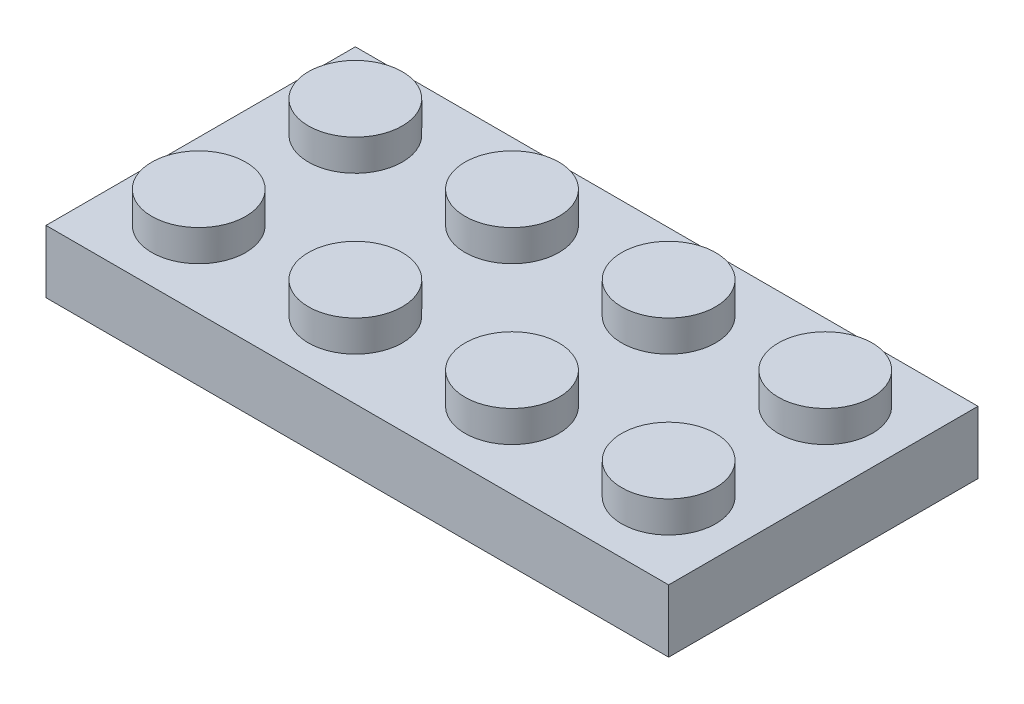
ISO-10303-21;
HEADER;
FILE_DESCRIPTION(('STEP AP214'),'2;1');
FILE_NAME('part.step','',(''),(''),'','','');
FILE_SCHEMA(('AUTOMOTIVE_DESIGN { 1 0 10303 214 1 1 1 1 }'));
ENDSEC;
DATA;
#1=APPLICATION_CONTEXT('core data for automotive mechanical design processes');
#2=APPLICATION_PROTOCOL_DEFINITION('international standard','automotive_design',2000,#1);
#3=PRODUCT_CONTEXT('',#1,'mechanical');
#4=PRODUCT('Part','Part','',(#3));
#5=PRODUCT_RELATED_PRODUCT_CATEGORY('part','',(#4));
#6=PRODUCT_DEFINITION_FORMATION('','',#4);
#7=PRODUCT_DEFINITION_CONTEXT('part definition',#1,'design');
#8=PRODUCT_DEFINITION('design','',#6,#7);
#9=PRODUCT_DEFINITION_SHAPE('','',#8);
#10=(LENGTH_UNIT() NAMED_UNIT(*) SI_UNIT(.MILLI.,.METRE.));
#11=(NAMED_UNIT(*) PLANE_ANGLE_UNIT() SI_UNIT($,.RADIAN.));
#12=(NAMED_UNIT(*) SI_UNIT($,.STERADIAN.) SOLID_ANGLE_UNIT());
#13=UNCERTAINTY_MEASURE_WITH_UNIT(LENGTH_MEASURE(1.E-05),#10,'distance_accuracy_value','');
#14=(GEOMETRIC_REPRESENTATION_CONTEXT(3) GLOBAL_UNCERTAINTY_ASSIGNED_CONTEXT((#13)) GLOBAL_UNIT_ASSIGNED_CONTEXT((#10,
#11,#12)) REPRESENTATION_CONTEXT('',''));
#15=CARTESIAN_POINT('',(0.,0.,0.));
#16=DIRECTION('',(0.,0.,1.));
#17=DIRECTION('',(1.,0.,0.));
#18=AXIS2_PLACEMENT_3D('',#15,#16,#17);
#19=CARTESIAN_POINT('',(0.681967213114738,0.,7.9));
#20=DIRECTION('',(0.,1.,0.));
#21=DIRECTION('',(0.,0.,1.));
#22=AXIS2_PLACEMENT_3D('',#19,#20,#21);
#23=PLANE('',#22);
#24=DIRECTION('',(1.,0.,0.));
#25=VECTOR('',#24,1.);
#26=CARTESIAN_POINT('',(0.681967213114738,0.,-7.9));
#27=LINE('',#26,#25);
#28=CARTESIAN_POINT('',(0.681967213114738,0.,-7.9));
#29=VERTEX_POINT('',#28);
#30=CARTESIAN_POINT('',(32.4819672131147,0.,-7.9));
#31=VERTEX_POINT('',#30);
#32=EDGE_CURVE('E185',#29,#31,#27,.T.);
#33=ORIENTED_EDGE('',*,*,#32,.T.);
#34=DIRECTION('',(0.,0.,-1.));
#35=VECTOR('',#34,1.);
#36=CARTESIAN_POINT('',(32.4819672131147,0.,7.9));
#37=LINE('',#36,#35);
#38=CARTESIAN_POINT('',(32.4819672131147,0.,7.9));
#39=VERTEX_POINT('',#38);
#40=EDGE_CURVE('E193',#39,#31,#37,.T.);
#41=ORIENTED_EDGE('',*,*,#40,.F.);
#42=DIRECTION('',(1.,0.,0.));
#43=VECTOR('',#42,1.);
#44=CARTESIAN_POINT('',(0.681967213114738,0.,7.9));
#45=LINE('',#44,#43);
#46=CARTESIAN_POINT('',(0.681967213114738,0.,7.9));
#47=VERTEX_POINT('',#46);
#48=EDGE_CURVE('E97',#47,#39,#45,.T.);
#49=ORIENTED_EDGE('',*,*,#48,.F.);
#50=DIRECTION('',(0.,0.,-1.));
#51=VECTOR('',#50,1.);
#52=CARTESIAN_POINT('',(0.681967213114738,0.,7.9));
#53=LINE('',#52,#51);
#54=EDGE_CURVE('E196',#47,#29,#53,.T.);
#55=ORIENTED_EDGE('',*,*,#54,.T.);
#56=EDGE_LOOP('',(#33,#41,#49,#55));
#57=FACE_BOUND('',#56,.T.);
#58=DIRECTION('',(1.,0.,0.));
#59=VECTOR('',#58,1.);
#60=CARTESIAN_POINT('',(0.,0.,-6.7));
#61=LINE('',#60,#59);
#62=CARTESIAN_POINT('',(1.88196721311474,0.,-6.7));
#63=VERTEX_POINT('',#62);
#64=CARTESIAN_POINT('',(31.2819672131147,0.,-6.7));
#65=VERTEX_POINT('',#64);
#66=EDGE_CURVE('E142',#63,#65,#61,.T.);
#67=ORIENTED_EDGE('',*,*,#66,.F.);
#68=DIRECTION('',(0.,0.,-1.));
#69=VECTOR('',#68,1.);
#70=CARTESIAN_POINT('',(1.88196721311474,0.,7.9));
#71=LINE('',#70,#69);
#72=CARTESIAN_POINT('',(1.88196721311474,0.,6.7));
#73=VERTEX_POINT('',#72);
#74=EDGE_CURVE('E141',#73,#63,#71,.T.);
#75=ORIENTED_EDGE('',*,*,#74,.F.);
#76=DIRECTION('',(1.,0.,0.));
#77=VECTOR('',#76,1.);
#78=CARTESIAN_POINT('',(0.,0.,6.7));
#79=LINE('',#78,#77);
#80=CARTESIAN_POINT('',(31.2819672131147,0.,6.7));
#81=VERTEX_POINT('',#80);
#82=EDGE_CURVE('E154',#73,#81,#79,.T.);
#83=ORIENTED_EDGE('',*,*,#82,.T.);
#84=DIRECTION('',(0.,0.,-1.));
#85=VECTOR('',#84,1.);
#86=CARTESIAN_POINT('',(31.2819672131147,0.,7.9));
#87=LINE('',#86,#85);
#88=EDGE_CURVE('E162',#81,#65,#87,.T.);
#89=ORIENTED_EDGE('',*,*,#88,.T.);
#90=EDGE_LOOP('',(#67,#75,#83,#89));
#91=FACE_BOUND('',#90,.T.);
#92=ADVANCED_FACE('F43',(#57,#91),#23,.F.);
#93=CARTESIAN_POINT('',(28.5819672131147,4.8,4.));
#94=DIRECTION('',(0.,1.,0.));
#95=DIRECTION('',(0.,0.,1.));
#96=AXIS2_PLACEMENT_3D('',#93,#94,#95);
#97=PLANE('',#96);
#98=CARTESIAN_POINT('',(28.5819672131147,4.8,4.));
#99=DIRECTION('',(0.,1.,0.));
#100=DIRECTION('',(0.,0.,1.));
#101=AXIS2_PLACEMENT_3D('',#98,#99,#100);
#102=CIRCLE('',#101,2.4);
#103=CARTESIAN_POINT('',(28.5819672131147,4.8,6.4));
#104=VERTEX_POINT('',#103);
#105=EDGE_CURVE('E237',#104,#104,#102,.T.);
#106=ORIENTED_EDGE('',*,*,#105,.T.);
#107=EDGE_LOOP('',(#106));
#108=FACE_BOUND('',#107,.T.);
#109=ADVANCED_FACE('F45',(#108),#97,.T.);
#110=CARTESIAN_POINT('',(28.5819672131147,4.8,4.));
#111=DIRECTION('',(0.,-1.,0.));
#112=DIRECTION('',(0.,0.,-1.));
#113=AXIS2_PLACEMENT_3D('',#110,#111,#112);
#114=CYLINDRICAL_SURFACE('',#113,2.4);
#115=ORIENTED_EDGE('',*,*,#105,.F.);
#116=EDGE_LOOP('',(#115));
#117=FACE_BOUND('',#116,.T.);
#118=CARTESIAN_POINT('',(28.5819672131147,3.2,4.));
#119=DIRECTION('',(0.,-1.,0.));
#120=DIRECTION('',(1.,0.,0.));
#121=AXIS2_PLACEMENT_3D('',#118,#119,#120);
#122=CIRCLE('',#121,2.4);
#123=CARTESIAN_POINT('',(30.9819672131147,3.2,4.));
#124=VERTEX_POINT('',#123);
#125=EDGE_CURVE('E234',#124,#124,#122,.F.);
#126=ORIENTED_EDGE('',*,*,#125,.T.);
#127=EDGE_LOOP('',(#126));
#128=FACE_BOUND('',#127,.T.);
#129=ADVANCED_FACE('F335',(#117,#128),#114,.T.);
#130=CARTESIAN_POINT('',(28.5819672131147,4.8,-4.));
#131=DIRECTION('',(0.,1.,0.));
#132=DIRECTION('',(0.,0.,1.));
#133=AXIS2_PLACEMENT_3D('',#130,#131,#132);
#134=PLANE('',#133);
#135=CARTESIAN_POINT('',(28.5819672131147,4.8,-4.));
#136=DIRECTION('',(0.,1.,0.));
#137=DIRECTION('',(0.,0.,1.));
#138=AXIS2_PLACEMENT_3D('',#135,#136,#137);
#139=CIRCLE('',#138,2.4);
#140=CARTESIAN_POINT('',(28.5819672131147,4.8,-1.6));
#141=VERTEX_POINT('',#140);
#142=EDGE_CURVE('E231',#141,#141,#139,.T.);
#143=ORIENTED_EDGE('',*,*,#142,.T.);
#144=EDGE_LOOP('',(#143));
#145=FACE_BOUND('',#144,.T.);
#146=ADVANCED_FACE('F381',(#145),#134,.T.);
#147=CARTESIAN_POINT('',(28.5819672131147,4.8,-4.));
#148=DIRECTION('',(0.,-1.,0.));
#149=DIRECTION('',(0.,0.,-1.));
#150=AXIS2_PLACEMENT_3D('',#147,#148,#149);
#151=CYLINDRICAL_SURFACE('',#150,2.4);
#152=ORIENTED_EDGE('',*,*,#142,.F.);
#153=EDGE_LOOP('',(#152));
#154=FACE_BOUND('',#153,.T.);
#155=CARTESIAN_POINT('',(28.5819672131147,3.2,-4.));
#156=DIRECTION('',(0.,-1.,0.));
#157=DIRECTION('',(1.,0.,0.));
#158=AXIS2_PLACEMENT_3D('',#155,#156,#157);
#159=CIRCLE('',#158,2.4);
#160=CARTESIAN_POINT('',(30.9819672131147,3.2,-4.));
#161=VERTEX_POINT('',#160);
#162=EDGE_CURVE('E228',#161,#161,#159,.F.);
#163=ORIENTED_EDGE('',*,*,#162,.T.);
#164=EDGE_LOOP('',(#163));
#165=FACE_BOUND('',#164,.T.);
#166=ADVANCED_FACE('F377',(#154,#165),#151,.T.);
#167=CARTESIAN_POINT('',(20.5819672131147,4.8,4.));
#168=DIRECTION('',(0.,1.,0.));
#169=DIRECTION('',(0.,0.,1.));
#170=AXIS2_PLACEMENT_3D('',#167,#168,#169);
#171=PLANE('',#170);
#172=CARTESIAN_POINT('',(20.5819672131147,4.8,4.));
#173=DIRECTION('',(0.,1.,0.));
#174=DIRECTION('',(0.,0.,1.));
#175=AXIS2_PLACEMENT_3D('',#172,#173,#174);
#176=CIRCLE('',#175,2.4);
#177=CARTESIAN_POINT('',(20.5819672131147,4.8,6.4));
#178=VERTEX_POINT('',#177);
#179=EDGE_CURVE('E225',#178,#178,#176,.T.);
#180=ORIENTED_EDGE('',*,*,#179,.T.);
#181=EDGE_LOOP('',(#180));
#182=FACE_BOUND('',#181,.T.);
#183=ADVANCED_FACE('F373',(#182),#171,.T.);
#184=CARTESIAN_POINT('',(20.5819672131147,4.8,4.));
#185=DIRECTION('',(0.,-1.,0.));
#186=DIRECTION('',(0.,0.,-1.));
#187=AXIS2_PLACEMENT_3D('',#184,#185,#186);
#188=CYLINDRICAL_SURFACE('',#187,2.4);
#189=ORIENTED_EDGE('',*,*,#179,.F.);
#190=EDGE_LOOP('',(#189));
#191=FACE_BOUND('',#190,.T.);
#192=CARTESIAN_POINT('',(20.5819672131147,3.2,4.));
#193=DIRECTION('',(0.,-1.,0.));
#194=DIRECTION('',(1.,0.,0.));
#195=AXIS2_PLACEMENT_3D('',#192,#193,#194);
#196=CIRCLE('',#195,2.4);
#197=CARTESIAN_POINT('',(22.9819672131147,3.2,4.));
#198=VERTEX_POINT('',#197);
#199=EDGE_CURVE('E222',#198,#198,#196,.F.);
#200=ORIENTED_EDGE('',*,*,#199,.T.);
#201=EDGE_LOOP('',(#200));
#202=FACE_BOUND('',#201,.T.);
#203=ADVANCED_FACE('F369',(#191,#202),#188,.T.);
#204=CARTESIAN_POINT('',(20.5819672131147,4.8,-4.));
#205=DIRECTION('',(0.,1.,0.));
#206=DIRECTION('',(0.,0.,1.));
#207=AXIS2_PLACEMENT_3D('',#204,#205,#206);
#208=PLANE('',#207);
#209=CARTESIAN_POINT('',(20.5819672131147,4.8,-4.));
#210=DIRECTION('',(0.,1.,0.));
#211=DIRECTION('',(0.,0.,1.));
#212=AXIS2_PLACEMENT_3D('',#209,#210,#211);
#213=CIRCLE('',#212,2.4);
#214=CARTESIAN_POINT('',(20.5819672131147,4.8,-1.6));
#215=VERTEX_POINT('',#214);
#216=EDGE_CURVE('E219',#215,#215,#213,.T.);
#217=ORIENTED_EDGE('',*,*,#216,.T.);
#218=EDGE_LOOP('',(#217));
#219=FACE_BOUND('',#218,.T.);
#220=ADVANCED_FACE('F365',(#219),#208,.T.);
#221=CARTESIAN_POINT('',(20.5819672131147,4.8,-4.));
#222=DIRECTION('',(0.,-1.,0.));
#223=DIRECTION('',(0.,0.,-1.));
#224=AXIS2_PLACEMENT_3D('',#221,#222,#223);
#225=CYLINDRICAL_SURFACE('',#224,2.4);
#226=ORIENTED_EDGE('',*,*,#216,.F.);
#227=EDGE_LOOP('',(#226));
#228=FACE_BOUND('',#227,.T.);
#229=CARTESIAN_POINT('',(20.5819672131147,3.2,-4.));
#230=DIRECTION('',(0.,-1.,0.));
#231=DIRECTION('',(1.,0.,0.));
#232=AXIS2_PLACEMENT_3D('',#229,#230,#231);
#233=CIRCLE('',#232,2.4);
#234=CARTESIAN_POINT('',(22.9819672131147,3.2,-4.));
#235=VERTEX_POINT('',#234);
#236=EDGE_CURVE('E216',#235,#235,#233,.F.);
#237=ORIENTED_EDGE('',*,*,#236,.T.);
#238=EDGE_LOOP('',(#237));
#239=FACE_BOUND('',#238,.T.);
#240=ADVANCED_FACE('F361',(#228,#239),#225,.T.);
#241=CARTESIAN_POINT('',(12.5819672131147,4.8,4.));
#242=DIRECTION('',(0.,1.,0.));
#243=DIRECTION('',(0.,0.,1.));
#244=AXIS2_PLACEMENT_3D('',#241,#242,#243);
#245=PLANE('',#244);
#246=CARTESIAN_POINT('',(12.5819672131147,4.8,4.));
#247=DIRECTION('',(0.,1.,0.));
#248=DIRECTION('',(0.,0.,1.));
#249=AXIS2_PLACEMENT_3D('',#246,#247,#248);
#250=CIRCLE('',#249,2.4);
#251=CARTESIAN_POINT('',(12.5819672131147,4.8,6.4));
#252=VERTEX_POINT('',#251);
#253=EDGE_CURVE('E213',#252,#252,#250,.T.);
#254=ORIENTED_EDGE('',*,*,#253,.T.);
#255=EDGE_LOOP('',(#254));
#256=FACE_BOUND('',#255,.T.);
#257=ADVANCED_FACE('F357',(#256),#245,.T.);
#258=CARTESIAN_POINT('',(12.5819672131147,4.8,4.));
#259=DIRECTION('',(0.,-1.,0.));
#260=DIRECTION('',(0.,0.,-1.));
#261=AXIS2_PLACEMENT_3D('',#258,#259,#260);
#262=CYLINDRICAL_SURFACE('',#261,2.4);
#263=ORIENTED_EDGE('',*,*,#253,.F.);
#264=EDGE_LOOP('',(#263));
#265=FACE_BOUND('',#264,.T.);
#266=CARTESIAN_POINT('',(12.5819672131147,3.2,4.));
#267=DIRECTION('',(0.,-1.,0.));
#268=DIRECTION('',(1.,0.,0.));
#269=AXIS2_PLACEMENT_3D('',#266,#267,#268);
#270=CIRCLE('',#269,2.4);
#271=CARTESIAN_POINT('',(14.9819672131147,3.2,4.));
#272=VERTEX_POINT('',#271);
#273=EDGE_CURVE('E210',#272,#272,#270,.F.);
#274=ORIENTED_EDGE('',*,*,#273,.T.);
#275=EDGE_LOOP('',(#274));
#276=FACE_BOUND('',#275,.T.);
#277=ADVANCED_FACE('F353',(#265,#276),#262,.T.);
#278=CARTESIAN_POINT('',(12.5819672131147,4.8,-4.));
#279=DIRECTION('',(0.,1.,0.));
#280=DIRECTION('',(0.,0.,1.));
#281=AXIS2_PLACEMENT_3D('',#278,#279,#280);
#282=PLANE('',#281);
#283=CARTESIAN_POINT('',(12.5819672131147,4.8,-4.));
#284=DIRECTION('',(0.,1.,0.));
#285=DIRECTION('',(0.,0.,1.));
#286=AXIS2_PLACEMENT_3D('',#283,#284,#285);
#287=CIRCLE('',#286,2.4);
#288=CARTESIAN_POINT('',(12.5819672131147,4.8,-1.6));
#289=VERTEX_POINT('',#288);
#290=EDGE_CURVE('E207',#289,#289,#287,.T.);
#291=ORIENTED_EDGE('',*,*,#290,.T.);
#292=EDGE_LOOP('',(#291));
#293=FACE_BOUND('',#292,.T.);
#294=ADVANCED_FACE('F349',(#293),#282,.T.);
#295=CARTESIAN_POINT('',(12.5819672131147,4.8,-4.));
#296=DIRECTION('',(0.,-1.,0.));
#297=DIRECTION('',(0.,0.,-1.));
#298=AXIS2_PLACEMENT_3D('',#295,#296,#297);
#299=CYLINDRICAL_SURFACE('',#298,2.4);
#300=ORIENTED_EDGE('',*,*,#290,.F.);
#301=EDGE_LOOP('',(#300));
#302=FACE_BOUND('',#301,.T.);
#303=CARTESIAN_POINT('',(12.5819672131147,3.2,-4.));
#304=DIRECTION('',(0.,-1.,0.));
#305=DIRECTION('',(1.,0.,0.));
#306=AXIS2_PLACEMENT_3D('',#303,#304,#305);
#307=CIRCLE('',#306,2.4);
#308=CARTESIAN_POINT('',(14.9819672131147,3.2,-4.));
#309=VERTEX_POINT('',#308);
#310=EDGE_CURVE('E204',#309,#309,#307,.F.);
#311=ORIENTED_EDGE('',*,*,#310,.T.);
#312=EDGE_LOOP('',(#311));
#313=FACE_BOUND('',#312,.T.);
#314=ADVANCED_FACE('F345',(#302,#313),#299,.T.);
#315=CARTESIAN_POINT('',(0.681967213114738,0.,7.9));
#316=DIRECTION('',(1.,0.,0.));
#317=DIRECTION('',(0.,0.,-1.));
#318=AXIS2_PLACEMENT_3D('',#315,#316,#317);
#319=PLANE('',#318);
#320=DIRECTION('',(0.,-1.,0.));
#321=VECTOR('',#320,1.);
#322=CARTESIAN_POINT('',(0.681967213114738,0.,-7.9));
#323=LINE('',#322,#321);
#324=CARTESIAN_POINT('',(0.681967213114738,3.2,-7.9));
#325=VERTEX_POINT('',#324);
#326=EDGE_CURVE('E175',#325,#29,#323,.T.);
#327=ORIENTED_EDGE('',*,*,#326,.T.);
#328=ORIENTED_EDGE('',*,*,#54,.F.);
#329=DIRECTION('',(0.,-1.,0.));
#330=VECTOR('',#329,1.);
#331=CARTESIAN_POINT('',(0.681967213114738,0.,7.9));
#332=LINE('',#331,#330);
#333=CARTESIAN_POINT('',(0.681967213114738,3.2,7.9));
#334=VERTEX_POINT('',#333);
#335=EDGE_CURVE('E176',#334,#47,#332,.T.);
#336=ORIENTED_EDGE('',*,*,#335,.F.);
#337=DIRECTION('',(0.,0.,-1.));
#338=VECTOR('',#337,1.);
#339=CARTESIAN_POINT('',(0.681967213114738,3.2,7.9));
#340=LINE('',#339,#338);
#341=EDGE_CURVE('E182',#334,#325,#340,.T.);
#342=ORIENTED_EDGE('',*,*,#341,.T.);
#343=EDGE_LOOP('',(#327,#328,#336,#342));
#344=FACE_BOUND('',#343,.T.);
#345=ADVANCED_FACE('F342',(#344),#319,.F.);
#346=CARTESIAN_POINT('',(32.4819672131147,0.,7.9));
#347=DIRECTION('',(-1.,0.,0.));
#348=DIRECTION('',(0.,0.,1.));
#349=AXIS2_PLACEMENT_3D('',#346,#347,#348);
#350=PLANE('',#349);
#351=DIRECTION('',(0.,1.,0.));
#352=VECTOR('',#351,1.);
#353=CARTESIAN_POINT('',(32.4819672131147,0.,-7.9));
#354=LINE('',#353,#352);
#355=CARTESIAN_POINT('',(32.4819672131147,3.2,-7.9));
#356=VERTEX_POINT('',#355);
#357=EDGE_CURVE('E187',#31,#356,#354,.T.);
#358=ORIENTED_EDGE('',*,*,#357,.T.);
#359=DIRECTION('',(0.,0.,-1.));
#360=VECTOR('',#359,1.);
#361=CARTESIAN_POINT('',(32.4819672131147,3.2,7.9));
#362=LINE('',#361,#360);
#363=CARTESIAN_POINT('',(32.4819672131147,3.2,7.9));
#364=VERTEX_POINT('',#363);
#365=EDGE_CURVE('E191',#364,#356,#362,.T.);
#366=ORIENTED_EDGE('',*,*,#365,.F.);
#367=DIRECTION('',(0.,1.,0.));
#368=VECTOR('',#367,1.);
#369=CARTESIAN_POINT('',(32.4819672131147,0.,7.9));
#370=LINE('',#369,#368);
#371=EDGE_CURVE('E179',#39,#364,#370,.T.);
#372=ORIENTED_EDGE('',*,*,#371,.F.);
#373=ORIENTED_EDGE('',*,*,#40,.T.);
#374=EDGE_LOOP('',(#358,#366,#372,#373));
#375=FACE_BOUND('',#374,.T.);
#376=ADVANCED_FACE('F340',(#375),#350,.F.);
#377=CARTESIAN_POINT('',(0.681967213114738,3.2,7.9));
#378=DIRECTION('',(0.,-1.,0.));
#379=DIRECTION('',(1.,0.,0.));
#380=AXIS2_PLACEMENT_3D('',#377,#378,#379);
#381=PLANE('',#380);
#382=CARTESIAN_POINT('',(4.58196721311474,3.2,4.));
#383=DIRECTION('',(0.,-1.,0.));
#384=DIRECTION('',(1.,0.,0.));
#385=AXIS2_PLACEMENT_3D('',#382,#383,#384);
#386=CIRCLE('',#385,2.4);
#387=CARTESIAN_POINT('',(6.98196721311474,3.2,4.));
#388=VERTEX_POINT('',#387);
#389=EDGE_CURVE('E201',#388,#388,#386,.F.);
#390=ORIENTED_EDGE('',*,*,#389,.F.);
#391=EDGE_LOOP('',(#390));
#392=FACE_BOUND('',#391,.T.);
#393=CARTESIAN_POINT('',(4.58196721311474,3.2,-4.));
#394=DIRECTION('',(0.,-1.,0.));
#395=DIRECTION('',(1.,0.,0.));
#396=AXIS2_PLACEMENT_3D('',#393,#394,#395);
#397=CIRCLE('',#396,2.4);
#398=CARTESIAN_POINT('',(6.98196721311474,3.2,-4.));
#399=VERTEX_POINT('',#398);
#400=EDGE_CURVE('E198',#399,#399,#397,.F.);
#401=ORIENTED_EDGE('',*,*,#400,.F.);
#402=EDGE_LOOP('',(#401));
#403=FACE_BOUND('',#402,.T.);
#404=DIRECTION('',(-1.,0.,0.));
#405=VECTOR('',#404,1.);
#406=CARTESIAN_POINT('',(0.681967213114738,3.2,-7.9));
#407=LINE('',#406,#405);
#408=EDGE_CURVE('E89',#356,#325,#407,.T.);
#409=ORIENTED_EDGE('',*,*,#408,.T.);
#410=ORIENTED_EDGE('',*,*,#341,.F.);
#411=DIRECTION('',(-1.,0.,0.));
#412=VECTOR('',#411,1.);
#413=CARTESIAN_POINT('',(0.681967213114738,3.2,7.9));
#414=LINE('',#413,#412);
#415=EDGE_CURVE('E68',#364,#334,#414,.T.);
#416=ORIENTED_EDGE('',*,*,#415,.F.);
#417=ORIENTED_EDGE('',*,*,#365,.T.);
#418=EDGE_LOOP('',(#409,#410,#416,#417));
#419=FACE_BOUND('',#418,.T.);
#420=ORIENTED_EDGE('',*,*,#310,.F.);
#421=EDGE_LOOP('',(#420));
#422=FACE_BOUND('',#421,.T.);
#423=ORIENTED_EDGE('',*,*,#273,.F.);
#424=EDGE_LOOP('',(#423));
#425=FACE_BOUND('',#424,.T.);
#426=ORIENTED_EDGE('',*,*,#236,.F.);
#427=EDGE_LOOP('',(#426));
#428=FACE_BOUND('',#427,.T.);
#429=ORIENTED_EDGE('',*,*,#199,.F.);
#430=EDGE_LOOP('',(#429));
#431=FACE_BOUND('',#430,.T.);
#432=ORIENTED_EDGE('',*,*,#162,.F.);
#433=EDGE_LOOP('',(#432));
#434=FACE_BOUND('',#433,.T.);
#435=ORIENTED_EDGE('',*,*,#125,.F.);
#436=EDGE_LOOP('',(#435));
#437=FACE_BOUND('',#436,.T.);
#438=ADVANCED_FACE('F393',(#392,#403,#419,#422,#425,#428,#431,#434,#437),#381,.F.);
#439=CARTESIAN_POINT('',(0.,0.,7.9));
#440=DIRECTION('',(0.,0.,-1.));
#441=DIRECTION('',(-1.,0.,0.));
#442=AXIS2_PLACEMENT_3D('',#439,#440,#441);
#443=PLANE('',#442);
#444=ORIENTED_EDGE('',*,*,#335,.T.);
#445=ORIENTED_EDGE('',*,*,#48,.T.);
#446=ORIENTED_EDGE('',*,*,#371,.T.);
#447=ORIENTED_EDGE('',*,*,#415,.T.);
#448=EDGE_LOOP('',(#444,#445,#446,#447));
#449=FACE_BOUND('',#448,.T.);
#450=ADVANCED_FACE('F395',(#449),#443,.F.);
#451=CARTESIAN_POINT('',(0.,0.,-7.9));
#452=DIRECTION('',(0.,0.,-1.));
#453=DIRECTION('',(-1.,0.,0.));
#454=AXIS2_PLACEMENT_3D('',#451,#452,#453);
#455=PLANE('',#454);
#456=ORIENTED_EDGE('',*,*,#326,.F.);
#457=ORIENTED_EDGE('',*,*,#408,.F.);
#458=ORIENTED_EDGE('',*,*,#357,.F.);
#459=ORIENTED_EDGE('',*,*,#32,.F.);
#460=EDGE_LOOP('',(#456,#457,#458,#459));
#461=FACE_BOUND('',#460,.T.);
#462=ADVANCED_FACE('F401',(#461),#455,.T.);
#463=CARTESIAN_POINT('',(4.58196721311474,4.8,-4.));
#464=DIRECTION('',(0.,-1.,0.));
#465=DIRECTION('',(0.,0.,-1.));
#466=AXIS2_PLACEMENT_3D('',#463,#464,#465);
#467=CYLINDRICAL_SURFACE('',#466,2.4);
#468=CARTESIAN_POINT('',(4.58196721311474,4.8,-4.));
#469=DIRECTION('',(0.,1.,0.));
#470=DIRECTION('',(0.,0.,1.));
#471=AXIS2_PLACEMENT_3D('',#468,#469,#470);
#472=CIRCLE('',#471,2.4);
#473=CARTESIAN_POINT('',(4.58196721311474,4.8,-1.6));
#474=VERTEX_POINT('',#473);
#475=EDGE_CURVE('E171',#474,#474,#472,.T.);
#476=ORIENTED_EDGE('',*,*,#475,.F.);
#477=EDGE_LOOP('',(#476));
#478=FACE_BOUND('',#477,.T.);
#479=ORIENTED_EDGE('',*,*,#400,.T.);
#480=EDGE_LOOP('',(#479));
#481=FACE_BOUND('',#480,.T.);
#482=ADVANCED_FACE('F409',(#478,#481),#467,.T.);
#483=CARTESIAN_POINT('',(4.58196721311474,4.8,-4.));
#484=DIRECTION('',(0.,1.,0.));
#485=DIRECTION('',(0.,0.,1.));
#486=AXIS2_PLACEMENT_3D('',#483,#484,#485);
#487=PLANE('',#486);
#488=ORIENTED_EDGE('',*,*,#475,.T.);
#489=EDGE_LOOP('',(#488));
#490=FACE_BOUND('',#489,.T.);
#491=ADVANCED_FACE('F414',(#490),#487,.T.);
#492=CARTESIAN_POINT('',(4.58196721311474,4.8,4.));
#493=DIRECTION('',(0.,-1.,0.));
#494=DIRECTION('',(0.,0.,-1.));
#495=AXIS2_PLACEMENT_3D('',#492,#493,#494);
#496=CYLINDRICAL_SURFACE('',#495,2.4);
#497=CARTESIAN_POINT('',(4.58196721311474,4.8,4.));
#498=DIRECTION('',(0.,1.,0.));
#499=DIRECTION('',(0.,0.,1.));
#500=AXIS2_PLACEMENT_3D('',#497,#498,#499);
#501=CIRCLE('',#500,2.4);
#502=CARTESIAN_POINT('',(4.58196721311474,4.8,6.4));
#503=VERTEX_POINT('',#502);
#504=EDGE_CURVE('E168',#503,#503,#501,.T.);
#505=ORIENTED_EDGE('',*,*,#504,.F.);
#506=EDGE_LOOP('',(#505));
#507=FACE_BOUND('',#506,.T.);
#508=ORIENTED_EDGE('',*,*,#389,.T.);
#509=EDGE_LOOP('',(#508));
#510=FACE_BOUND('',#509,.T.);
#511=ADVANCED_FACE('F418',(#507,#510),#496,.T.);
#512=CARTESIAN_POINT('',(4.58196721311474,4.8,4.));
#513=DIRECTION('',(0.,1.,0.));
#514=DIRECTION('',(0.,0.,1.));
#515=AXIS2_PLACEMENT_3D('',#512,#513,#514);
#516=PLANE('',#515);
#517=ORIENTED_EDGE('',*,*,#504,.T.);
#518=EDGE_LOOP('',(#517));
#519=FACE_BOUND('',#518,.T.);
#520=ADVANCED_FACE('F421',(#519),#516,.T.);
#521=CARTESIAN_POINT('',(28.5819672131147,3.6,4.));
#522=DIRECTION('',(0.,1.,0.));
#523=DIRECTION('',(0.,0.,1.));
#524=AXIS2_PLACEMENT_3D('',#521,#522,#523);
#525=PLANE('',#524);
#526=CARTESIAN_POINT('',(28.5819672131147,3.6,4.));
#527=DIRECTION('',(0.,1.,0.));
#528=DIRECTION('',(0.,0.,1.));
#529=AXIS2_PLACEMENT_3D('',#526,#527,#528);
#530=CIRCLE('',#529,1.2);
#531=CARTESIAN_POINT('',(28.5819672131147,3.6,5.2));
#532=VERTEX_POINT('',#531);
#533=EDGE_CURVE('E172',#532,#532,#530,.T.);
#534=ORIENTED_EDGE('',*,*,#533,.F.);
#535=EDGE_LOOP('',(#534));
#536=FACE_BOUND('',#535,.T.);
#537=ADVANCED_FACE('F425',(#536),#525,.F.);
#538=CARTESIAN_POINT('',(28.5819672131147,4.8,4.));
#539=DIRECTION('',(0.,-1.,0.));
#540=DIRECTION('',(0.,0.,-1.));
#541=AXIS2_PLACEMENT_3D('',#538,#539,#540);
#542=CYLINDRICAL_SURFACE('',#541,1.2);
#543=ORIENTED_EDGE('',*,*,#533,.T.);
#544=EDGE_LOOP('',(#543));
#545=FACE_BOUND('',#544,.T.);
#546=CARTESIAN_POINT('',(28.5819672131147,2.,4.));
#547=DIRECTION('',(0.,-1.,0.));
#548=DIRECTION('',(1.,0.,0.));
#549=AXIS2_PLACEMENT_3D('',#546,#547,#548);
#550=CIRCLE('',#549,1.2);
#551=CARTESIAN_POINT('',(29.7819672131147,2.,4.));
#552=VERTEX_POINT('',#551);
#553=EDGE_CURVE('E275',#552,#552,#550,.F.);
#554=ORIENTED_EDGE('',*,*,#553,.F.);
#555=EDGE_LOOP('',(#554));
#556=FACE_BOUND('',#555,.T.);
#557=ADVANCED_FACE('F483',(#545,#556),#542,.F.);
#558=CARTESIAN_POINT('',(28.5819672131147,3.6,-4.));
#559=DIRECTION('',(0.,1.,0.));
#560=DIRECTION('',(0.,0.,1.));
#561=AXIS2_PLACEMENT_3D('',#558,#559,#560);
#562=PLANE('',#561);
#563=CARTESIAN_POINT('',(28.5819672131147,3.6,-4.));
#564=DIRECTION('',(0.,1.,0.));
#565=DIRECTION('',(0.,0.,1.));
#566=AXIS2_PLACEMENT_3D('',#563,#564,#565);
#567=CIRCLE('',#566,1.2);
#568=CARTESIAN_POINT('',(28.5819672131147,3.6,-2.8));
#569=VERTEX_POINT('',#568);
#570=EDGE_CURVE('E278',#569,#569,#567,.T.);
#571=ORIENTED_EDGE('',*,*,#570,.F.);
#572=EDGE_LOOP('',(#571));
#573=FACE_BOUND('',#572,.T.);
#574=ADVANCED_FACE('F485',(#573),#562,.F.);
#575=CARTESIAN_POINT('',(28.5819672131147,4.8,-4.));
#576=DIRECTION('',(0.,-1.,0.));
#577=DIRECTION('',(0.,0.,-1.));
#578=AXIS2_PLACEMENT_3D('',#575,#576,#577);
#579=CYLINDRICAL_SURFACE('',#578,1.2);
#580=ORIENTED_EDGE('',*,*,#570,.T.);
#581=EDGE_LOOP('',(#580));
#582=FACE_BOUND('',#581,.T.);
#583=CARTESIAN_POINT('',(28.5819672131147,2.,-4.));
#584=DIRECTION('',(0.,-1.,0.));
#585=DIRECTION('',(1.,0.,0.));
#586=AXIS2_PLACEMENT_3D('',#583,#584,#585);
#587=CIRCLE('',#586,1.2);
#588=CARTESIAN_POINT('',(29.7819672131147,2.,-4.));
#589=VERTEX_POINT('',#588);
#590=EDGE_CURVE('E301',#589,#589,#587,.F.);
#591=ORIENTED_EDGE('',*,*,#590,.F.);
#592=EDGE_LOOP('',(#591));
#593=FACE_BOUND('',#592,.T.);
#594=ADVANCED_FACE('F492',(#582,#593),#579,.F.);
#595=CARTESIAN_POINT('',(20.5819672131147,3.6,4.));
#596=DIRECTION('',(0.,1.,0.));
#597=DIRECTION('',(0.,0.,1.));
#598=AXIS2_PLACEMENT_3D('',#595,#596,#597);
#599=PLANE('',#598);
#600=CARTESIAN_POINT('',(20.5819672131147,3.6,4.));
#601=DIRECTION('',(0.,1.,0.));
#602=DIRECTION('',(0.,0.,1.));
#603=AXIS2_PLACEMENT_3D('',#600,#601,#602);
#604=CIRCLE('',#603,1.2);
#605=CARTESIAN_POINT('',(20.5819672131147,3.6,5.2));
#606=VERTEX_POINT('',#605);
#607=EDGE_CURVE('E300',#606,#606,#604,.T.);
#608=ORIENTED_EDGE('',*,*,#607,.F.);
#609=EDGE_LOOP('',(#608));
#610=FACE_BOUND('',#609,.T.);
#611=ADVANCED_FACE('F501',(#610),#599,.F.);
#612=CARTESIAN_POINT('',(20.5819672131147,4.8,4.));
#613=DIRECTION('',(0.,-1.,0.));
#614=DIRECTION('',(0.,0.,-1.));
#615=AXIS2_PLACEMENT_3D('',#612,#613,#614);
#616=CYLINDRICAL_SURFACE('',#615,1.2);
#617=ORIENTED_EDGE('',*,*,#607,.T.);
#618=EDGE_LOOP('',(#617));
#619=FACE_BOUND('',#618,.T.);
#620=CARTESIAN_POINT('',(20.5819672131147,2.,4.));
#621=DIRECTION('',(0.,-1.,0.));
#622=DIRECTION('',(1.,0.,0.));
#623=AXIS2_PLACEMENT_3D('',#620,#621,#622);
#624=CIRCLE('',#623,1.2);
#625=CARTESIAN_POINT('',(21.7819672131147,2.,4.));
#626=VERTEX_POINT('',#625);
#627=EDGE_CURVE('E297',#626,#626,#624,.F.);
#628=ORIENTED_EDGE('',*,*,#627,.F.);
#629=EDGE_LOOP('',(#628));
#630=FACE_BOUND('',#629,.T.);
#631=ADVANCED_FACE('F505',(#619,#630),#616,.F.);
#632=CARTESIAN_POINT('',(20.5819672131147,3.6,-4.));
#633=DIRECTION('',(0.,1.,0.));
#634=DIRECTION('',(0.,0.,1.));
#635=AXIS2_PLACEMENT_3D('',#632,#633,#634);
#636=PLANE('',#635);
#637=CARTESIAN_POINT('',(20.5819672131147,3.6,-4.));
#638=DIRECTION('',(0.,1.,0.));
#639=DIRECTION('',(0.,0.,1.));
#640=AXIS2_PLACEMENT_3D('',#637,#638,#639);
#641=CIRCLE('',#640,1.2);
#642=CARTESIAN_POINT('',(20.5819672131147,3.6,-2.8));
#643=VERTEX_POINT('',#642);
#644=EDGE_CURVE('E296',#643,#643,#641,.T.);
#645=ORIENTED_EDGE('',*,*,#644,.F.);
#646=EDGE_LOOP('',(#645));
#647=FACE_BOUND('',#646,.T.);
#648=ADVANCED_FACE('F325',(#647),#636,.F.);
#649=CARTESIAN_POINT('',(20.5819672131147,4.8,-4.));
#650=DIRECTION('',(0.,-1.,0.));
#651=DIRECTION('',(0.,0.,-1.));
#652=AXIS2_PLACEMENT_3D('',#649,#650,#651);
#653=CYLINDRICAL_SURFACE('',#652,1.2);
#654=ORIENTED_EDGE('',*,*,#644,.T.);
#655=EDGE_LOOP('',(#654));
#656=FACE_BOUND('',#655,.T.);
#657=CARTESIAN_POINT('',(20.5819672131147,2.,-4.));
#658=DIRECTION('',(0.,-1.,0.));
#659=DIRECTION('',(1.,0.,0.));
#660=AXIS2_PLACEMENT_3D('',#657,#658,#659);
#661=CIRCLE('',#660,1.2);
#662=CARTESIAN_POINT('',(21.7819672131147,2.,-4.));
#663=VERTEX_POINT('',#662);
#664=EDGE_CURVE('E293',#663,#663,#661,.F.);
#665=ORIENTED_EDGE('',*,*,#664,.F.);
#666=EDGE_LOOP('',(#665));
#667=FACE_BOUND('',#666,.T.);
#668=ADVANCED_FACE('F317',(#656,#667),#653,.F.);
#669=CARTESIAN_POINT('',(12.5819672131147,3.6,4.));
#670=DIRECTION('',(0.,1.,0.));
#671=DIRECTION('',(0.,0.,1.));
#672=AXIS2_PLACEMENT_3D('',#669,#670,#671);
#673=PLANE('',#672);
#674=CARTESIAN_POINT('',(12.5819672131147,3.6,4.));
#675=DIRECTION('',(0.,1.,0.));
#676=DIRECTION('',(0.,0.,1.));
#677=AXIS2_PLACEMENT_3D('',#674,#675,#676);
#678=CIRCLE('',#677,1.2);
#679=CARTESIAN_POINT('',(12.5819672131147,3.6,5.2));
#680=VERTEX_POINT('',#679);
#681=EDGE_CURVE('E292',#680,#680,#678,.T.);
#682=ORIENTED_EDGE('',*,*,#681,.F.);
#683=EDGE_LOOP('',(#682));
#684=FACE_BOUND('',#683,.T.);
#685=ADVANCED_FACE('F315',(#684),#673,.F.);
#686=CARTESIAN_POINT('',(12.5819672131147,4.8,4.));
#687=DIRECTION('',(0.,-1.,0.));
#688=DIRECTION('',(0.,0.,-1.));
#689=AXIS2_PLACEMENT_3D('',#686,#687,#688);
#690=CYLINDRICAL_SURFACE('',#689,1.2);
#691=ORIENTED_EDGE('',*,*,#681,.T.);
#692=EDGE_LOOP('',(#691));
#693=FACE_BOUND('',#692,.T.);
#694=CARTESIAN_POINT('',(12.5819672131147,2.,4.));
#695=DIRECTION('',(0.,-1.,0.));
#696=DIRECTION('',(1.,0.,0.));
#697=AXIS2_PLACEMENT_3D('',#694,#695,#696);
#698=CIRCLE('',#697,1.2);
#699=CARTESIAN_POINT('',(13.7819672131147,2.,4.));
#700=VERTEX_POINT('',#699);
#701=EDGE_CURVE('E289',#700,#700,#698,.F.);
#702=ORIENTED_EDGE('',*,*,#701,.F.);
#703=EDGE_LOOP('',(#702));
#704=FACE_BOUND('',#703,.T.);
#705=ADVANCED_FACE('F312',(#693,#704),#690,.F.);
#706=CARTESIAN_POINT('',(12.5819672131147,3.6,-4.));
#707=DIRECTION('',(0.,1.,0.));
#708=DIRECTION('',(0.,0.,1.));
#709=AXIS2_PLACEMENT_3D('',#706,#707,#708);
#710=PLANE('',#709);
#711=CARTESIAN_POINT('',(12.5819672131147,3.6,-4.));
#712=DIRECTION('',(0.,1.,0.));
#713=DIRECTION('',(0.,0.,1.));
#714=AXIS2_PLACEMENT_3D('',#711,#712,#713);
#715=CIRCLE('',#714,1.2);
#716=CARTESIAN_POINT('',(12.5819672131147,3.6,-2.8));
#717=VERTEX_POINT('',#716);
#718=EDGE_CURVE('E151',#717,#717,#715,.T.);
#719=ORIENTED_EDGE('',*,*,#718,.F.);
#720=EDGE_LOOP('',(#719));
#721=FACE_BOUND('',#720,.T.);
#722=ADVANCED_FACE('F323',(#721),#710,.F.);
#723=CARTESIAN_POINT('',(12.5819672131147,4.8,-4.));
#724=DIRECTION('',(0.,-1.,0.));
#725=DIRECTION('',(0.,0.,-1.));
#726=AXIS2_PLACEMENT_3D('',#723,#724,#725);
#727=CYLINDRICAL_SURFACE('',#726,1.2);
#728=ORIENTED_EDGE('',*,*,#718,.T.);
#729=EDGE_LOOP('',(#728));
#730=FACE_BOUND('',#729,.T.);
#731=CARTESIAN_POINT('',(12.5819672131147,2.,-4.));
#732=DIRECTION('',(0.,-1.,0.));
#733=DIRECTION('',(1.,0.,0.));
#734=AXIS2_PLACEMENT_3D('',#731,#732,#733);
#735=CIRCLE('',#734,1.2);
#736=CARTESIAN_POINT('',(13.7819672131147,2.,-4.));
#737=VERTEX_POINT('',#736);
#738=EDGE_CURVE('E282',#737,#737,#735,.F.);
#739=ORIENTED_EDGE('',*,*,#738,.F.);
#740=EDGE_LOOP('',(#739));
#741=FACE_BOUND('',#740,.T.);
#742=ADVANCED_FACE('F460',(#730,#741),#727,.F.);
#743=CARTESIAN_POINT('',(1.88196721311474,0.,7.9));
#744=DIRECTION('',(1.,0.,0.));
#745=DIRECTION('',(0.,0.,-1.));
#746=AXIS2_PLACEMENT_3D('',#743,#744,#745);
#747=PLANE('',#746);
#748=DIRECTION('',(0.,-1.,0.));
#749=VECTOR('',#748,1.);
#750=CARTESIAN_POINT('',(1.88196721311474,0.,-6.7));
#751=LINE('',#750,#749);
#752=CARTESIAN_POINT('',(1.88196721311474,2.,-6.7));
#753=VERTEX_POINT('',#752);
#754=EDGE_CURVE('E124',#753,#63,#751,.T.);
#755=ORIENTED_EDGE('',*,*,#754,.F.);
#756=DIRECTION('',(0.,0.,-1.));
#757=VECTOR('',#756,1.);
#758=CARTESIAN_POINT('',(1.88196721311474,2.,7.9));
#759=LINE('',#758,#757);
#760=CARTESIAN_POINT('',(1.88196721311474,2.,6.7));
#761=VERTEX_POINT('',#760);
#762=EDGE_CURVE('E132',#761,#753,#759,.T.);
#763=ORIENTED_EDGE('',*,*,#762,.F.);
#764=DIRECTION('',(0.,-1.,0.));
#765=VECTOR('',#764,1.);
#766=CARTESIAN_POINT('',(1.88196721311474,0.,6.7));
#767=LINE('',#766,#765);
#768=EDGE_CURVE('E59',#761,#73,#767,.T.);
#769=ORIENTED_EDGE('',*,*,#768,.T.);
#770=ORIENTED_EDGE('',*,*,#74,.T.);
#771=EDGE_LOOP('',(#755,#763,#769,#770));
#772=FACE_BOUND('',#771,.T.);
#773=ADVANCED_FACE('F139',(#772),#747,.T.);
#774=CARTESIAN_POINT('',(31.2819672131147,0.,7.9));
#775=DIRECTION('',(-1.,0.,0.));
#776=DIRECTION('',(0.,0.,1.));
#777=AXIS2_PLACEMENT_3D('',#774,#775,#776);
#778=PLANE('',#777);
#779=DIRECTION('',(0.,1.,0.));
#780=VECTOR('',#779,1.);
#781=CARTESIAN_POINT('',(31.2819672131147,0.,-6.7));
#782=LINE('',#781,#780);
#783=CARTESIAN_POINT('',(31.2819672131147,2.,-6.7));
#784=VERTEX_POINT('',#783);
#785=EDGE_CURVE('E127',#65,#784,#782,.T.);
#786=ORIENTED_EDGE('',*,*,#785,.F.);
#787=ORIENTED_EDGE('',*,*,#88,.F.);
#788=DIRECTION('',(0.,1.,0.));
#789=VECTOR('',#788,1.);
#790=CARTESIAN_POINT('',(31.2819672131147,0.,6.7));
#791=LINE('',#790,#789);
#792=CARTESIAN_POINT('',(31.2819672131147,2.,6.7));
#793=VERTEX_POINT('',#792);
#794=EDGE_CURVE('E155',#81,#793,#791,.T.);
#795=ORIENTED_EDGE('',*,*,#794,.T.);
#796=DIRECTION('',(0.,0.,-1.));
#797=VECTOR('',#796,1.);
#798=CARTESIAN_POINT('',(31.2819672131147,2.,7.9));
#799=LINE('',#798,#797);
#800=EDGE_CURVE('E137',#793,#784,#799,.T.);
#801=ORIENTED_EDGE('',*,*,#800,.T.);
#802=EDGE_LOOP('',(#786,#787,#795,#801));
#803=FACE_BOUND('',#802,.T.);
#804=ADVANCED_FACE('F452',(#803),#778,.T.);
#805=CARTESIAN_POINT('',(0.681967213114738,2.,7.9));
#806=DIRECTION('',(0.,-1.,0.));
#807=DIRECTION('',(1.,0.,0.));
#808=AXIS2_PLACEMENT_3D('',#805,#806,#807);
#809=PLANE('',#808);
#810=CARTESIAN_POINT('',(16.5819672131147,2.,0.));
#811=DIRECTION('',(0.,-1.,0.));
#812=DIRECTION('',(1.,0.,0.));
#813=AXIS2_PLACEMENT_3D('',#810,#811,#812);
#814=CIRCLE('',#813,3.14);
#815=CARTESIAN_POINT('',(19.7219672131147,2.,0.));
#816=VERTEX_POINT('',#815);
#817=EDGE_CURVE('E47',#816,#816,#814,.F.);
#818=ORIENTED_EDGE('',*,*,#817,.T.);
#819=EDGE_LOOP('',(#818));
#820=FACE_BOUND('',#819,.T.);
#821=CARTESIAN_POINT('',(24.5819672131147,2.,0.));
#822=DIRECTION('',(0.,-1.,0.));
#823=DIRECTION('',(1.,0.,0.));
#824=AXIS2_PLACEMENT_3D('',#821,#822,#823);
#825=CIRCLE('',#824,3.14);
#826=CARTESIAN_POINT('',(27.7219672131147,2.,0.));
#827=VERTEX_POINT('',#826);
#828=EDGE_CURVE('E248',#827,#827,#825,.F.);
#829=ORIENTED_EDGE('',*,*,#828,.T.);
#830=EDGE_LOOP('',(#829));
#831=FACE_BOUND('',#830,.T.);
#832=CARTESIAN_POINT('',(8.58196721311474,2.,0.));
#833=DIRECTION('',(0.,-1.,0.));
#834=DIRECTION('',(1.,0.,0.));
#835=AXIS2_PLACEMENT_3D('',#832,#833,#834);
#836=CIRCLE('',#835,3.14);
#837=CARTESIAN_POINT('',(11.7219672131147,2.,0.));
#838=VERTEX_POINT('',#837);
#839=EDGE_CURVE('E160',#838,#838,#836,.F.);
#840=ORIENTED_EDGE('',*,*,#839,.T.);
#841=EDGE_LOOP('',(#840));
#842=FACE_BOUND('',#841,.T.);
#843=CARTESIAN_POINT('',(4.58196721311474,2.,4.));
#844=DIRECTION('',(0.,-1.,0.));
#845=DIRECTION('',(1.,0.,0.));
#846=AXIS2_PLACEMENT_3D('',#843,#844,#845);
#847=CIRCLE('',#846,1.2);
#848=CARTESIAN_POINT('',(5.78196721311474,2.,4.));
#849=VERTEX_POINT('',#848);
#850=EDGE_CURVE('E279',#849,#849,#847,.F.);
#851=ORIENTED_EDGE('',*,*,#850,.T.);
#852=EDGE_LOOP('',(#851));
#853=FACE_BOUND('',#852,.T.);
#854=CARTESIAN_POINT('',(4.58196721311474,2.,-4.));
#855=DIRECTION('',(0.,-1.,0.));
#856=DIRECTION('',(1.,0.,0.));
#857=AXIS2_PLACEMENT_3D('',#854,#855,#856);
#858=CIRCLE('',#857,1.2);
#859=CARTESIAN_POINT('',(5.78196721311474,2.,-4.));
#860=VERTEX_POINT('',#859);
#861=EDGE_CURVE('E161',#860,#860,#858,.F.);
#862=ORIENTED_EDGE('',*,*,#861,.T.);
#863=EDGE_LOOP('',(#862));
#864=FACE_BOUND('',#863,.T.);
#865=DIRECTION('',(-1.,0.,0.));
#866=VECTOR('',#865,1.);
#867=CARTESIAN_POINT('',(0.,2.,-6.7));
#868=LINE('',#867,#866);
#869=EDGE_CURVE('E120',#784,#753,#868,.T.);
#870=ORIENTED_EDGE('',*,*,#869,.F.);
#871=ORIENTED_EDGE('',*,*,#800,.F.);
#872=DIRECTION('',(-1.,0.,0.));
#873=VECTOR('',#872,1.);
#874=CARTESIAN_POINT('',(0.,2.,6.7));
#875=LINE('',#874,#873);
#876=EDGE_CURVE('E136',#793,#761,#875,.T.);
#877=ORIENTED_EDGE('',*,*,#876,.T.);
#878=ORIENTED_EDGE('',*,*,#762,.T.);
#879=EDGE_LOOP('',(#870,#871,#877,#878));
#880=FACE_BOUND('',#879,.T.);
#881=ORIENTED_EDGE('',*,*,#738,.T.);
#882=EDGE_LOOP('',(#881));
#883=FACE_BOUND('',#882,.T.);
#884=ORIENTED_EDGE('',*,*,#701,.T.);
#885=EDGE_LOOP('',(#884));
#886=FACE_BOUND('',#885,.T.);
#887=ORIENTED_EDGE('',*,*,#664,.T.);
#888=EDGE_LOOP('',(#887));
#889=FACE_BOUND('',#888,.T.);
#890=ORIENTED_EDGE('',*,*,#627,.T.);
#891=EDGE_LOOP('',(#890));
#892=FACE_BOUND('',#891,.T.);
#893=ORIENTED_EDGE('',*,*,#590,.T.);
#894=EDGE_LOOP('',(#893));
#895=FACE_BOUND('',#894,.T.);
#896=ORIENTED_EDGE('',*,*,#553,.T.);
#897=EDGE_LOOP('',(#896));
#898=FACE_BOUND('',#897,.T.);
#899=ADVANCED_FACE('F133',(#820,#831,#842,#853,#864,#880,#883,#886,#889,#892,#895,#898),#809,.T.);
#900=CARTESIAN_POINT('',(0.,0.,6.7));
#901=DIRECTION('',(0.,0.,-1.));
#902=DIRECTION('',(-1.,0.,0.));
#903=AXIS2_PLACEMENT_3D('',#900,#901,#902);
#904=PLANE('',#903);
#905=ORIENTED_EDGE('',*,*,#768,.F.);
#906=ORIENTED_EDGE('',*,*,#876,.F.);
#907=ORIENTED_EDGE('',*,*,#794,.F.);
#908=ORIENTED_EDGE('',*,*,#82,.F.);
#909=EDGE_LOOP('',(#905,#906,#907,#908));
#910=FACE_BOUND('',#909,.T.);
#911=ADVANCED_FACE('F446',(#910),#904,.T.);
#912=CARTESIAN_POINT('',(0.,0.,-6.7));
#913=DIRECTION('',(0.,0.,-1.));
#914=DIRECTION('',(-1.,0.,0.));
#915=AXIS2_PLACEMENT_3D('',#912,#913,#914);
#916=PLANE('',#915);
#917=ORIENTED_EDGE('',*,*,#754,.T.);
#918=ORIENTED_EDGE('',*,*,#66,.T.);
#919=ORIENTED_EDGE('',*,*,#785,.T.);
#920=ORIENTED_EDGE('',*,*,#869,.T.);
#921=EDGE_LOOP('',(#917,#918,#919,#920));
#922=FACE_BOUND('',#921,.T.);
#923=ADVANCED_FACE('F122',(#922),#916,.F.);
#924=CARTESIAN_POINT('',(4.58196721311474,4.8,-4.));
#925=DIRECTION('',(0.,-1.,0.));
#926=DIRECTION('',(0.,0.,-1.));
#927=AXIS2_PLACEMENT_3D('',#924,#925,#926);
#928=CYLINDRICAL_SURFACE('',#927,1.2);
#929=CARTESIAN_POINT('',(4.58196721311474,3.6,-4.));
#930=DIRECTION('',(0.,1.,0.));
#931=DIRECTION('',(0.,0.,1.));
#932=AXIS2_PLACEMENT_3D('',#929,#930,#931);
#933=CIRCLE('',#932,1.2);
#934=CARTESIAN_POINT('',(4.58196721311474,3.6,-2.8));
#935=VERTEX_POINT('',#934);
#936=EDGE_CURVE('E143',#935,#935,#933,.T.);
#937=ORIENTED_EDGE('',*,*,#936,.T.);
#938=EDGE_LOOP('',(#937));
#939=FACE_BOUND('',#938,.T.);
#940=ORIENTED_EDGE('',*,*,#861,.F.);
#941=EDGE_LOOP('',(#940));
#942=FACE_BOUND('',#941,.T.);
#943=ADVANCED_FACE('F439',(#939,#942),#928,.F.);
#944=CARTESIAN_POINT('',(4.58196721311474,3.6,-4.));
#945=DIRECTION('',(0.,1.,0.));
#946=DIRECTION('',(0.,0.,1.));
#947=AXIS2_PLACEMENT_3D('',#944,#945,#946);
#948=PLANE('',#947);
#949=ORIENTED_EDGE('',*,*,#936,.F.);
#950=EDGE_LOOP('',(#949));
#951=FACE_BOUND('',#950,.T.);
#952=ADVANCED_FACE('F435',(#951),#948,.F.);
#953=CARTESIAN_POINT('',(4.58196721311474,4.8,4.));
#954=DIRECTION('',(0.,-1.,0.));
#955=DIRECTION('',(0.,0.,-1.));
#956=AXIS2_PLACEMENT_3D('',#953,#954,#955);
#957=CYLINDRICAL_SURFACE('',#956,1.2);
#958=CARTESIAN_POINT('',(4.58196721311474,3.6,4.));
#959=DIRECTION('',(0.,1.,0.));
#960=DIRECTION('',(0.,0.,1.));
#961=AXIS2_PLACEMENT_3D('',#958,#959,#960);
#962=CIRCLE('',#961,1.2);
#963=CARTESIAN_POINT('',(4.58196721311474,3.6,5.2));
#964=VERTEX_POINT('',#963);
#965=EDGE_CURVE('E147',#964,#964,#962,.T.);
#966=ORIENTED_EDGE('',*,*,#965,.T.);
#967=EDGE_LOOP('',(#966));
#968=FACE_BOUND('',#967,.T.);
#969=ORIENTED_EDGE('',*,*,#850,.F.);
#970=EDGE_LOOP('',(#969));
#971=FACE_BOUND('',#970,.T.);
#972=ADVANCED_FACE('F431',(#968,#971),#957,.F.);
#973=CARTESIAN_POINT('',(4.58196721311474,3.6,4.));
#974=DIRECTION('',(0.,1.,0.));
#975=DIRECTION('',(0.,0.,1.));
#976=AXIS2_PLACEMENT_3D('',#973,#974,#975);
#977=PLANE('',#976);
#978=ORIENTED_EDGE('',*,*,#965,.F.);
#979=EDGE_LOOP('',(#978));
#980=FACE_BOUND('',#979,.T.);
#981=ADVANCED_FACE('F427',(#980),#977,.F.);
#982=CARTESIAN_POINT('',(8.58196721311474,0.6,0.));
#983=DIRECTION('',(0.,-1.,0.));
#984=DIRECTION('',(0.,0.,-1.));
#985=AXIS2_PLACEMENT_3D('',#982,#983,#984);
#986=PLANE('',#985);
#987=CARTESIAN_POINT('',(8.58196721311474,0.6,0.));
#988=DIRECTION('',(0.,-1.,0.));
#989=DIRECTION('',(0.,0.,-1.));
#990=AXIS2_PLACEMENT_3D('',#987,#988,#989);
#991=CIRCLE('',#990,3.14);
#992=CARTESIAN_POINT('',(8.58196721311474,0.6,-3.14));
#993=VERTEX_POINT('',#992);
#994=EDGE_CURVE('E245',#993,#993,#991,.T.);
#995=ORIENTED_EDGE('',*,*,#994,.T.);
#996=EDGE_LOOP('',(#995));
#997=FACE_BOUND('',#996,.T.);
#998=CARTESIAN_POINT('',(8.58196721311474,0.6,0.));
#999=DIRECTION('',(0.,-1.,0.));
#1000=DIRECTION('',(0.,0.,-1.));
#1001=AXIS2_PLACEMENT_3D('',#998,#999,#1000);
#1002=CIRCLE('',#1001,2.4);
#1003=CARTESIAN_POINT('',(8.58196721311474,0.6,-2.4));
#1004=VERTEX_POINT('',#1003);
#1005=EDGE_CURVE('E254',#1004,#1004,#1002,.T.);
#1006=ORIENTED_EDGE('',*,*,#1005,.F.);
#1007=EDGE_LOOP('',(#1006));
#1008=FACE_BOUND('',#1007,.T.);
#1009=ADVANCED_FACE('F430',(#997,#1008),#986,.T.);
#1010=CARTESIAN_POINT('',(8.58196721311474,0.6,0.));
#1011=DIRECTION('',(0.,1.,0.));
#1012=DIRECTION('',(0.,0.,1.));
#1013=AXIS2_PLACEMENT_3D('',#1010,#1011,#1012);
#1014=CYLINDRICAL_SURFACE('',#1013,3.14);
#1015=ORIENTED_EDGE('',*,*,#839,.F.);
#1016=EDGE_LOOP('',(#1015));
#1017=FACE_BOUND('',#1016,.T.);
#1018=ORIENTED_EDGE('',*,*,#994,.F.);
#1019=EDGE_LOOP('',(#1018));
#1020=FACE_BOUND('',#1019,.T.);
#1021=ADVANCED_FACE('F621',(#1017,#1020),#1014,.T.);
#1022=CARTESIAN_POINT('',(8.58196721311474,0.6,0.));
#1023=DIRECTION('',(0.,1.,0.));
#1024=DIRECTION('',(0.,0.,1.));
#1025=AXIS2_PLACEMENT_3D('',#1022,#1023,#1024);
#1026=CYLINDRICAL_SURFACE('',#1025,2.4);
#1027=CARTESIAN_POINT('',(8.58196721311474,2.,0.));
#1028=DIRECTION('',(0.,-1.,0.));
#1029=DIRECTION('',(1.,0.,0.));
#1030=AXIS2_PLACEMENT_3D('',#1027,#1028,#1029);
#1031=CIRCLE('',#1030,2.4);
#1032=CARTESIAN_POINT('',(10.9819672131147,2.,0.));
#1033=VERTEX_POINT('',#1032);
#1034=EDGE_CURVE('E240',#1033,#1033,#1031,.F.);
#1035=ORIENTED_EDGE('',*,*,#1034,.T.);
#1036=EDGE_LOOP('',(#1035));
#1037=FACE_BOUND('',#1036,.T.);
#1038=ORIENTED_EDGE('',*,*,#1005,.T.);
#1039=EDGE_LOOP('',(#1038));
#1040=FACE_BOUND('',#1039,.T.);
#1041=ADVANCED_FACE('F612',(#1037,#1040),#1026,.F.);
#1042=ORIENTED_EDGE('',*,*,#1034,.F.);
#1043=EDGE_LOOP('',(#1042));
#1044=FACE_BOUND('',#1043,.T.);
#1045=ADVANCED_FACE('F455',(#1044),#809,.T.);
#1046=CARTESIAN_POINT('',(24.5819672131147,0.600000000000001,0.));
#1047=DIRECTION('',(0.,-1.,0.));
#1048=DIRECTION('',(0.,0.,-1.));
#1049=AXIS2_PLACEMENT_3D('',#1046,#1047,#1048);
#1050=PLANE('',#1049);
#1051=CARTESIAN_POINT('',(24.5819672131147,0.600000000000001,0.));
#1052=DIRECTION('',(0.,-1.,0.));
#1053=DIRECTION('',(0.,0.,-1.));
#1054=AXIS2_PLACEMENT_3D('',#1051,#1052,#1053);
#1055=CIRCLE('',#1054,3.14);
#1056=CARTESIAN_POINT('',(24.5819672131147,0.600000000000001,-3.14));
#1057=VERTEX_POINT('',#1056);
#1058=EDGE_CURVE('E261',#1057,#1057,#1055,.T.);
#1059=ORIENTED_EDGE('',*,*,#1058,.T.);
#1060=EDGE_LOOP('',(#1059));
#1061=FACE_BOUND('',#1060,.T.);
#1062=CARTESIAN_POINT('',(24.5819672131147,0.600000000000001,0.));
#1063=DIRECTION('',(0.,-1.,0.));
#1064=DIRECTION('',(0.,0.,-1.));
#1065=AXIS2_PLACEMENT_3D('',#1062,#1063,#1064);
#1066=CIRCLE('',#1065,2.4);
#1067=CARTESIAN_POINT('',(24.5819672131147,0.600000000000001,-2.4));
#1068=VERTEX_POINT('',#1067);
#1069=EDGE_CURVE('E264',#1068,#1068,#1066,.T.);
#1070=ORIENTED_EDGE('',*,*,#1069,.F.);
#1071=EDGE_LOOP('',(#1070));
#1072=FACE_BOUND('',#1071,.T.);
#1073=ADVANCED_FACE('F611',(#1061,#1072),#1050,.T.);
#1074=CARTESIAN_POINT('',(24.5819672131147,0.600000000000001,0.));
#1075=DIRECTION('',(0.,1.,0.));
#1076=DIRECTION('',(0.,0.,1.));
#1077=AXIS2_PLACEMENT_3D('',#1074,#1075,#1076);
#1078=CYLINDRICAL_SURFACE('',#1077,3.14);
#1079=ORIENTED_EDGE('',*,*,#828,.F.);
#1080=EDGE_LOOP('',(#1079));
#1081=FACE_BOUND('',#1080,.T.);
#1082=ORIENTED_EDGE('',*,*,#1058,.F.);
#1083=EDGE_LOOP('',(#1082));
#1084=FACE_BOUND('',#1083,.T.);
#1085=ADVANCED_FACE('F668',(#1081,#1084),#1078,.T.);
#1086=CARTESIAN_POINT('',(24.5819672131147,0.600000000000001,0.));
#1087=DIRECTION('',(0.,1.,0.));
#1088=DIRECTION('',(0.,0.,1.));
#1089=AXIS2_PLACEMENT_3D('',#1086,#1087,#1088);
#1090=CYLINDRICAL_SURFACE('',#1089,2.4);
#1091=CARTESIAN_POINT('',(24.5819672131147,2.,0.));
#1092=DIRECTION('',(0.,-1.,0.));
#1093=DIRECTION('',(1.,0.,0.));
#1094=AXIS2_PLACEMENT_3D('',#1091,#1092,#1093);
#1095=CIRCLE('',#1094,2.4);
#1096=CARTESIAN_POINT('',(26.9819672131147,2.,0.));
#1097=VERTEX_POINT('',#1096);
#1098=EDGE_CURVE('E52',#1097,#1097,#1095,.F.);
#1099=ORIENTED_EDGE('',*,*,#1098,.T.);
#1100=EDGE_LOOP('',(#1099));
#1101=FACE_BOUND('',#1100,.T.);
#1102=ORIENTED_EDGE('',*,*,#1069,.T.);
#1103=EDGE_LOOP('',(#1102));
#1104=FACE_BOUND('',#1103,.T.);
#1105=ADVANCED_FACE('F649',(#1101,#1104),#1090,.F.);
#1106=ORIENTED_EDGE('',*,*,#1098,.F.);
#1107=EDGE_LOOP('',(#1106));
#1108=FACE_BOUND('',#1107,.T.);
#1109=ADVANCED_FACE('F614',(#1108),#809,.T.);
#1110=CARTESIAN_POINT('',(16.5819672131147,0.6,0.));
#1111=DIRECTION('',(0.,-1.,0.));
#1112=DIRECTION('',(0.,0.,-1.));
#1113=AXIS2_PLACEMENT_3D('',#1110,#1111,#1112);
#1114=PLANE('',#1113);
#1115=CARTESIAN_POINT('',(16.5819672131147,0.6,0.));
#1116=DIRECTION('',(0.,-1.,0.));
#1117=DIRECTION('',(0.,0.,-1.));
#1118=AXIS2_PLACEMENT_3D('',#1115,#1116,#1117);
#1119=CIRCLE('',#1118,3.14);
#1120=CARTESIAN_POINT('',(16.5819672131147,0.6,-3.14));
#1121=VERTEX_POINT('',#1120);
#1122=EDGE_CURVE('E250',#1121,#1121,#1119,.T.);
#1123=ORIENTED_EDGE('',*,*,#1122,.T.);
#1124=EDGE_LOOP('',(#1123));
#1125=FACE_BOUND('',#1124,.T.);
#1126=CARTESIAN_POINT('',(16.5819672131147,0.6,0.));
#1127=DIRECTION('',(0.,-1.,0.));
#1128=DIRECTION('',(0.,0.,-1.));
#1129=AXIS2_PLACEMENT_3D('',#1126,#1127,#1128);
#1130=CIRCLE('',#1129,2.4);
#1131=CARTESIAN_POINT('',(16.5819672131147,0.6,-2.4));
#1132=VERTEX_POINT('',#1131);
#1133=EDGE_CURVE('E256',#1132,#1132,#1130,.T.);
#1134=ORIENTED_EDGE('',*,*,#1133,.F.);
#1135=EDGE_LOOP('',(#1134));
#1136=FACE_BOUND('',#1135,.T.);
#1137=ADVANCED_FACE('F648',(#1125,#1136),#1114,.T.);
#1138=CARTESIAN_POINT('',(16.5819672131147,0.6,0.));
#1139=DIRECTION('',(0.,1.,0.));
#1140=DIRECTION('',(0.,0.,1.));
#1141=AXIS2_PLACEMENT_3D('',#1138,#1139,#1140);
#1142=CYLINDRICAL_SURFACE('',#1141,3.14);
#1143=ORIENTED_EDGE('',*,*,#817,.F.);
#1144=EDGE_LOOP('',(#1143));
#1145=FACE_BOUND('',#1144,.T.);
#1146=ORIENTED_EDGE('',*,*,#1122,.F.);
#1147=EDGE_LOOP('',(#1146));
#1148=FACE_BOUND('',#1147,.T.);
#1149=ADVANCED_FACE('F696',(#1145,#1148),#1142,.T.);
#1150=CARTESIAN_POINT('',(16.5819672131147,0.6,0.));
#1151=DIRECTION('',(0.,1.,0.));
#1152=DIRECTION('',(0.,0.,1.));
#1153=AXIS2_PLACEMENT_3D('',#1150,#1151,#1152);
#1154=CYLINDRICAL_SURFACE('',#1153,2.4);
#1155=CARTESIAN_POINT('',(16.5819672131147,2.,0.));
#1156=DIRECTION('',(0.,-1.,0.));
#1157=DIRECTION('',(1.,0.,0.));
#1158=AXIS2_PLACEMENT_3D('',#1155,#1156,#1157);
#1159=CIRCLE('',#1158,2.4);
#1160=CARTESIAN_POINT('',(18.9819672131147,2.,0.));
#1161=VERTEX_POINT('',#1160);
#1162=EDGE_CURVE('E11',#1161,#1161,#1159,.F.);
#1163=ORIENTED_EDGE('',*,*,#1162,.T.);
#1164=EDGE_LOOP('',(#1163));
#1165=FACE_BOUND('',#1164,.T.);
#1166=ORIENTED_EDGE('',*,*,#1133,.T.);
#1167=EDGE_LOOP('',(#1166));
#1168=FACE_BOUND('',#1167,.T.);
#1169=ADVANCED_FACE('F659',(#1165,#1168),#1154,.F.);
#1170=ORIENTED_EDGE('',*,*,#1162,.F.);
#1171=EDGE_LOOP('',(#1170));
#1172=FACE_BOUND('',#1171,.T.);
#1173=ADVANCED_FACE('F454',(#1172),#809,.T.);
#1174=CLOSED_SHELL('',(#92,#109,#129,#146,#166,#183,#203,#220,#240,#257,#277,#294,#314,#345,
#376,#438,#450,#462,#482,#491,#511,#520,#537,#557,#574,#594,#611,#631,#648,#668,#685,#705,#722,
#742,#773,#804,#899,#911,#923,#943,#952,#972,#981,#1009,#1021,#1041,#1045,#1073,#1085,#1105,
#1109,#1137,#1149,#1169,#1173));
#1175=MANIFOLD_SOLID_BREP('B2',#1174);
#1176=ADVANCED_BREP_SHAPE_REPRESENTATION('',(#18,#1175),#14);
#1177=SHAPE_DEFINITION_REPRESENTATION(#9,#1176);
ENDSEC;
END-ISO-10303-21;
